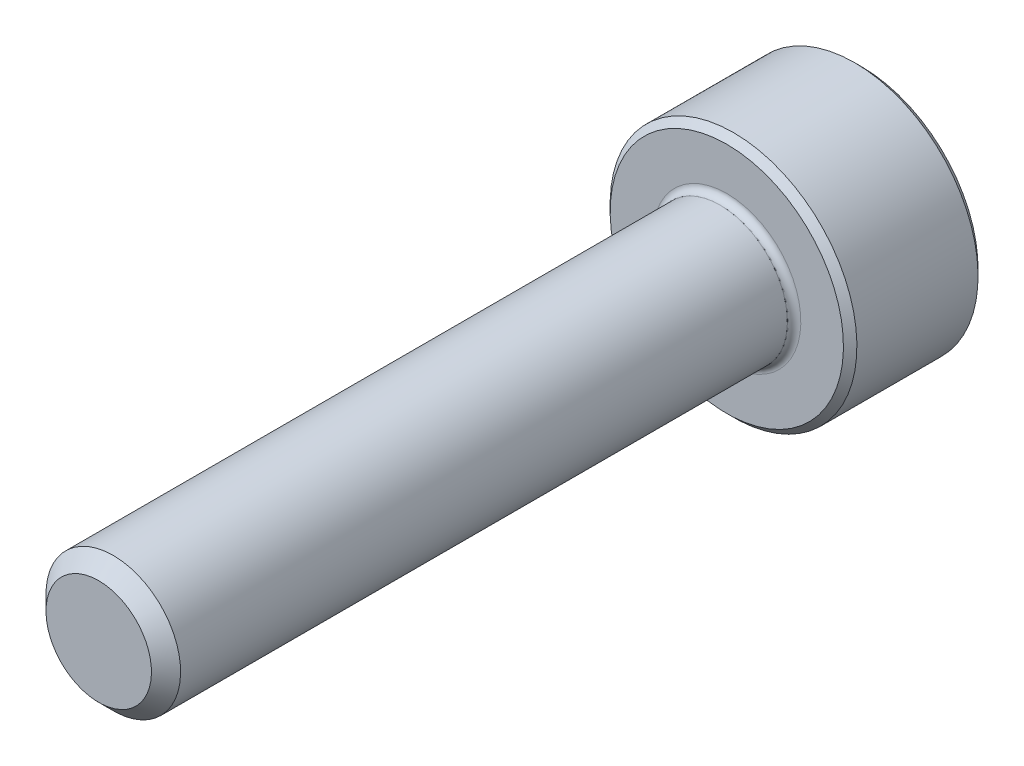
ISO-10303-21;
HEADER;
FILE_DESCRIPTION(('STEP AP214'),'2;1');
FILE_NAME('part.step','',(''),(''),'','','');
FILE_SCHEMA(('AUTOMOTIVE_DESIGN { 1 0 10303 214 1 1 1 1 }'));
ENDSEC;
DATA;
#1=APPLICATION_CONTEXT('core data for automotive mechanical design processes');
#2=APPLICATION_PROTOCOL_DEFINITION('international standard','automotive_design',2000,#1);
#3=PRODUCT_CONTEXT('',#1,'mechanical');
#4=PRODUCT('Part','Part','',(#3));
#5=PRODUCT_RELATED_PRODUCT_CATEGORY('part','',(#4));
#6=PRODUCT_DEFINITION_FORMATION('','',#4);
#7=PRODUCT_DEFINITION_CONTEXT('part definition',#1,'design');
#8=PRODUCT_DEFINITION('design','',#6,#7);
#9=PRODUCT_DEFINITION_SHAPE('','',#8);
#10=(LENGTH_UNIT() NAMED_UNIT(*) SI_UNIT(.MILLI.,.METRE.));
#11=(NAMED_UNIT(*) PLANE_ANGLE_UNIT() SI_UNIT($,.RADIAN.));
#12=(NAMED_UNIT(*) SI_UNIT($,.STERADIAN.) SOLID_ANGLE_UNIT());
#13=UNCERTAINTY_MEASURE_WITH_UNIT(LENGTH_MEASURE(1.E-05),#10,'distance_accuracy_value','');
#14=(GEOMETRIC_REPRESENTATION_CONTEXT(3) GLOBAL_UNCERTAINTY_ASSIGNED_CONTEXT((#13)) GLOBAL_UNIT_ASSIGNED_CONTEXT((#10,
#11,#12)) REPRESENTATION_CONTEXT('',''));
#15=CARTESIAN_POINT('',(0.,0.,0.));
#16=DIRECTION('',(0.,0.,1.));
#17=DIRECTION('',(1.,0.,0.));
#18=AXIS2_PLACEMENT_3D('',#15,#16,#17);
#19=CARTESIAN_POINT('',(0.,0.,-5.5));
#20=DIRECTION('',(0.,0.,-1.));
#21=DIRECTION('',(0.,-1.,0.));
#22=AXIS2_PLACEMENT_3D('',#19,#20,#21);
#23=PLANE('',#22);
#24=CARTESIAN_POINT('',(0.,0.,-5.5));
#25=DIRECTION('',(0.,0.,-1.));
#26=DIRECTION('',(0.,1.,0.));
#27=AXIS2_PLACEMENT_3D('',#24,#25,#26);
#28=CIRCLE('',#27,1.5);
#29=CARTESIAN_POINT('',(0.,1.5,-5.5));
#30=VERTEX_POINT('',#29);
#31=EDGE_CURVE('E12',#30,#30,#28,.T.);
#32=ORIENTED_EDGE('',*,*,#31,.T.);
#33=EDGE_LOOP('',(#32));
#34=FACE_BOUND('',#33,.T.);
#35=ADVANCED_FACE('F47',(#34),#23,.T.);
#36=CARTESIAN_POINT('',(0.,0.,-4.48397459621555));
#37=DIRECTION('',(0.,0.,1.));
#38=DIRECTION('',(0.,1.,0.));
#39=AXIS2_PLACEMENT_3D('',#36,#37,#38);
#40=CYLINDRICAL_SURFACE('',#39,1.5);
#41=ORIENTED_EDGE('',*,*,#31,.F.);
#42=EDGE_LOOP('',(#41));
#43=FACE_BOUND('',#42,.T.);
#44=CARTESIAN_POINT('',(0.,0.,-5.35));
#45=DIRECTION('',(0.,0.,-1.));
#46=DIRECTION('',(0.,1.,0.));
#47=AXIS2_PLACEMENT_3D('',#44,#45,#46);
#48=CIRCLE('',#47,1.5);
#49=CARTESIAN_POINT('',(0.,1.5,-5.35));
#50=VERTEX_POINT('',#49);
#51=EDGE_CURVE('E53',#50,#50,#48,.T.);
#52=ORIENTED_EDGE('',*,*,#51,.T.);
#53=EDGE_LOOP('',(#52));
#54=FACE_BOUND('',#53,.T.);
#55=ADVANCED_FACE('F58',(#43,#54),#40,.T.);
#56=CARTESIAN_POINT('',(0.,0.,-4.48397459621555));
#57=DIRECTION('',(0.,0.,-1.));
#58=DIRECTION('',(0.,-1.,0.));
#59=AXIS2_PLACEMENT_3D('',#56,#57,#58);
#60=CONICAL_SURFACE('',#59,0.,1.04719755119659);
#61=ORIENTED_EDGE('',*,*,#51,.F.);
#62=EDGE_LOOP('',(#61));
#63=FACE_BOUND('',#62,.T.);
#64=CARTESIAN_POINT('',(0.,0.,-4.48397459621555));
#65=VERTEX_POINT('',#64);
#66=VERTEX_LOOP('',#65);
#67=FACE_BOUND('',#66,.T.);
#68=ADVANCED_FACE('F56',(#63,#67),#60,.T.);
#69=CLOSED_SHELL('',(#35,#55,#68));
#70=MANIFOLD_SOLID_BREP('B2',#69);
#71=CARTESIAN_POINT('',(-2.76,-2.75,-5.35));
#72=DIRECTION('',(0.,0.,1.));
#73=DIRECTION('',(-1.,0.,0.));
#74=AXIS2_PLACEMENT_3D('',#71,#72,#73);
#75=PLANE('',#74);
#76=CARTESIAN_POINT('',(0.,0.,-5.35));
#77=DIRECTION('',(0.,0.,-1.));
#78=DIRECTION('',(0.,1.,0.));
#79=AXIS2_PLACEMENT_3D('',#76,#77,#78);
#80=CIRCLE('',#79,1.5);
#81=CARTESIAN_POINT('',(0.,1.5,-5.35));
#82=VERTEX_POINT('',#81);
#83=EDGE_CURVE('E106',#82,#82,#80,.T.);
#84=ORIENTED_EDGE('',*,*,#83,.F.);
#85=EDGE_LOOP('',(#84));
#86=FACE_BOUND('',#85,.T.);
#87=ADVANCED_FACE('F103',(#86),#75,.T.);
#88=CARTESIAN_POINT('',(0.,0.,-5.35));
#89=DIRECTION('',(0.,0.,1.));
#90=DIRECTION('',(0.,1.,0.));
#91=AXIS2_PLACEMENT_3D('',#88,#89,#90);
#92=TOROIDAL_SURFACE('',#91,1.65,0.15);
#93=CARTESIAN_POINT('',(0.,0.,-5.5));
#94=DIRECTION('',(0.,0.,-1.));
#95=DIRECTION('',(0.,1.,0.));
#96=AXIS2_PLACEMENT_3D('',#93,#94,#95);
#97=CIRCLE('',#96,1.65);
#98=CARTESIAN_POINT('',(0.,1.65,-5.5));
#99=VERTEX_POINT('',#98);
#100=EDGE_CURVE('E181',#99,#99,#97,.T.);
#101=ORIENTED_EDGE('',*,*,#100,.F.);
#102=EDGE_LOOP('',(#101));
#103=FACE_BOUND('',#102,.T.);
#104=ORIENTED_EDGE('',*,*,#83,.T.);
#105=EDGE_LOOP('',(#104));
#106=FACE_BOUND('',#105,.T.);
#107=ADVANCED_FACE('F281',(#103,#106),#92,.F.);
#108=CARTESIAN_POINT('',(0.,2.6,-5.5));
#109=DIRECTION('',(0.,0.,1.));
#110=DIRECTION('',(0.,1.,0.));
#111=AXIS2_PLACEMENT_3D('',#108,#109,#110);
#112=PLANE('',#111);
#113=CARTESIAN_POINT('',(0.,0.,-5.5));
#114=DIRECTION('',(0.,0.,-1.));
#115=DIRECTION('',(0.,1.,0.));
#116=AXIS2_PLACEMENT_3D('',#113,#114,#115);
#117=CIRCLE('',#116,2.6);
#118=CARTESIAN_POINT('',(0.,2.6,-5.5));
#119=VERTEX_POINT('',#118);
#120=EDGE_CURVE('E184',#119,#119,#117,.T.);
#121=ORIENTED_EDGE('',*,*,#120,.F.);
#122=EDGE_LOOP('',(#121));
#123=FACE_BOUND('',#122,.T.);
#124=ORIENTED_EDGE('',*,*,#100,.T.);
#125=EDGE_LOOP('',(#124));
#126=FACE_BOUND('',#125,.T.);
#127=ADVANCED_FACE('F278',(#123,#126),#112,.T.);
#128=CARTESIAN_POINT('',(0.,0.,-5.5));
#129=DIRECTION('',(0.,0.,-1.));
#130=DIRECTION('',(0.,-1.,0.));
#131=AXIS2_PLACEMENT_3D('',#128,#129,#130);
#132=CONICAL_SURFACE('',#131,2.6,0.785398163397451);
#133=CARTESIAN_POINT('',(0.,0.,-5.65));
#134=DIRECTION('',(0.,0.,-1.));
#135=DIRECTION('',(0.,1.,0.));
#136=AXIS2_PLACEMENT_3D('',#133,#134,#135);
#137=CIRCLE('',#136,2.75);
#138=CARTESIAN_POINT('',(0.,2.75,-5.65));
#139=VERTEX_POINT('',#138);
#140=EDGE_CURVE('E271',#139,#139,#137,.T.);
#141=ORIENTED_EDGE('',*,*,#140,.F.);
#142=EDGE_LOOP('',(#141));
#143=FACE_BOUND('',#142,.T.);
#144=ORIENTED_EDGE('',*,*,#120,.T.);
#145=EDGE_LOOP('',(#144));
#146=FACE_BOUND('',#145,.T.);
#147=ADVANCED_FACE('F276',(#143,#146),#132,.T.);
#148=CARTESIAN_POINT('',(0.,0.,8.5));
#149=DIRECTION('',(0.,0.,1.));
#150=DIRECTION('',(0.,1.,0.));
#151=AXIS2_PLACEMENT_3D('',#148,#149,#150);
#152=CYLINDRICAL_SURFACE('',#151,2.75);
#153=CARTESIAN_POINT('',(0.,0.,-8.35));
#154=DIRECTION('',(0.,0.,-1.));
#155=DIRECTION('',(0.,1.,0.));
#156=AXIS2_PLACEMENT_3D('',#153,#154,#155);
#157=CIRCLE('',#156,2.75);
#158=CARTESIAN_POINT('',(0.,2.75,-8.35));
#159=VERTEX_POINT('',#158);
#160=EDGE_CURVE('E268',#159,#159,#157,.T.);
#161=ORIENTED_EDGE('',*,*,#160,.F.);
#162=EDGE_LOOP('',(#161));
#163=FACE_BOUND('',#162,.T.);
#164=ORIENTED_EDGE('',*,*,#140,.T.);
#165=EDGE_LOOP('',(#164));
#166=FACE_BOUND('',#165,.T.);
#167=ADVANCED_FACE('F307',(#163,#166),#152,.T.);
#168=CARTESIAN_POINT('',(0.,0.,-8.35));
#169=DIRECTION('',(0.,0.,1.));
#170=DIRECTION('',(0.,1.,0.));
#171=AXIS2_PLACEMENT_3D('',#168,#169,#170);
#172=CONICAL_SURFACE('',#171,2.75,0.785398163397445);
#173=CARTESIAN_POINT('',(0.,0.,-8.5));
#174=DIRECTION('',(0.,0.,-1.));
#175=DIRECTION('',(0.,1.,0.));
#176=AXIS2_PLACEMENT_3D('',#173,#174,#175);
#177=CIRCLE('',#176,2.6);
#178=CARTESIAN_POINT('',(0.,2.6,-8.5));
#179=VERTEX_POINT('',#178);
#180=EDGE_CURVE('E167',#179,#179,#177,.T.);
#181=ORIENTED_EDGE('',*,*,#180,.F.);
#182=EDGE_LOOP('',(#181));
#183=FACE_BOUND('',#182,.T.);
#184=ORIENTED_EDGE('',*,*,#160,.T.);
#185=EDGE_LOOP('',(#184));
#186=FACE_BOUND('',#185,.T.);
#187=ADVANCED_FACE('F315',(#183,#186),#172,.T.);
#188=CARTESIAN_POINT('',(0.,0.,-8.5));
#189=DIRECTION('',(0.,0.,-1.));
#190=DIRECTION('',(0.,-1.,0.));
#191=AXIS2_PLACEMENT_3D('',#188,#189,#190);
#192=PLANE('',#191);
#193=CARTESIAN_POINT('',(0.,0.,-8.5));
#194=DIRECTION('',(0.,0.,1.));
#195=DIRECTION('',(1.,0.,0.));
#196=AXIS2_PLACEMENT_3D('',#193,#194,#195);
#197=CIRCLE('',#196,1.55162884844712);
#198=CARTESIAN_POINT('',(1.55162884844712,0.,-8.5));
#199=VERTEX_POINT('',#198);
#200=EDGE_CURVE('E45',#199,#199,#197,.T.);
#201=ORIENTED_EDGE('',*,*,#200,.T.);
#202=EDGE_LOOP('',(#201));
#203=FACE_BOUND('',#202,.T.);
#204=ORIENTED_EDGE('',*,*,#180,.T.);
#205=EDGE_LOOP('',(#204));
#206=FACE_BOUND('',#205,.T.);
#207=ADVANCED_FACE('F323',(#203,#206),#192,.T.);
#208=CARTESIAN_POINT('',(0.,0.,-8.5));
#209=DIRECTION('',(0.,0.,-1.));
#210=DIRECTION('',(1.,0.,0.));
#211=AXIS2_PLACEMENT_3D('',#208,#209,#210);
#212=CONICAL_SURFACE('',#211,1.55162884844712,0.78539816339745);
#213=ORIENTED_EDGE('',*,*,#200,.F.);
#214=EDGE_LOOP('',(#213));
#215=FACE_BOUND('',#214,.T.);
#216=CARTESIAN_POINT('',(-0.000199999999999042,-1.4434911430279,-8.39186230843608));
#217=CARTESIAN_POINT('',(0.0427751670715875,-1.41867941875065,-8.36706849258205));
#218=CARTESIAN_POINT('',(0.0864690047459489,-1.39345276980743,-8.34373055894563));
#219=CARTESIAN_POINT('',(0.175565930841943,-1.34201263554194,-8.30099882861148));
#220=CARTESIAN_POINT('',(0.220977498357065,-1.31579425481276,-8.28162881688736));
#221=CARTESIAN_POINT('',(0.312547820935262,-1.26292610442246,-8.24844730794042));
#222=CARTESIAN_POINT('',(0.358683240175887,-1.23628980770471,-8.2345523835796));
#223=CARTESIAN_POINT('',(0.451970080407594,-1.18243062538508,-8.21314410668758));
#224=CARTESIAN_POINT('',(0.499118649136382,-1.15520938653761,-8.20561476609373));
#225=CARTESIAN_POINT('',(0.580373556887254,-1.10829684367467,-8.19882132257765));
#226=CARTESIAN_POINT('',(0.614374876627943,-1.08866617256958,-8.1978153836313));
#227=CARTESIAN_POINT('',(0.68231776443248,-1.04943932800611,-8.19950823943827));
#228=CARTESIAN_POINT('',(0.71625931765566,-1.02984316311599,-8.20220785174249));
#229=CARTESIAN_POINT('',(0.783814856457502,-0.990839954603498,-8.21115575484333));
#230=CARTESIAN_POINT('',(0.817428507286777,-0.97143310424877,-8.21740735042665));
#231=CARTESIAN_POINT('',(0.884094638217815,-0.932943395609904,-8.23312250594085));
#232=CARTESIAN_POINT('',(0.917146871030298,-0.913860680098299,-8.24258744461441));
#233=CARTESIAN_POINT('',(1.00179969160027,-0.864986351354567,-8.27067821521453));
#234=CARTESIAN_POINT('',(1.05286649242964,-0.835502920149075,-8.29141698197915));
#235=CARTESIAN_POINT('',(1.15300085411326,-0.777690319475908,-8.33813395919842));
#236=CARTESIAN_POINT('',(1.20207431157827,-0.749357745598417,-8.36409512047371));
#237=CARTESIAN_POINT('',(1.2502,-0.721572366433194,-8.39186230843608));
#238=B_SPLINE_CURVE_WITH_KNOTS('',3,(#216,#217,#218,#219,#220,#221,#222,#223,#224,#225,#226,
#227,#228,#229,#230,#231,#232,#233,#234,#235,#236,#237),.UNSPECIFIED.,.F.,.F.,(4,2,2,2,2,2,2,2,
2,2,4),(0.,0.166533409618304,0.334037607289762,0.498880396489699,0.663307919240276,
0.780963963458828,0.898645970148455,1.01643764860773,1.1342799317155,1.32148652032141,
1.50809158792573),.UNSPECIFIED.);
#239=CARTESIAN_POINT('',(0.,-1.44337567297406,-8.39174682452695));
#240=VERTEX_POINT('',#239);
#241=CARTESIAN_POINT('',(1.25,-0.721687836487032,-8.39174682452695));
#242=VERTEX_POINT('',#241);
#243=EDGE_CURVE('E161',#240,#242,#238,.T.);
#244=ORIENTED_EDGE('',*,*,#243,.T.);
#245=CARTESIAN_POINT('',(1.25,-1.52022146239345,-8.91651070319084));
#246=CARTESIAN_POINT('',(1.25,-1.48354689134962,-8.88818689718723));
#247=CARTESIAN_POINT('',(1.25,-1.44667707589305,-8.86011672093047));
#248=CARTESIAN_POINT('',(1.25,-1.37246477804769,-8.80459065501776));
#249=CARTESIAN_POINT('',(1.25,-1.33512218721453,-8.77713491044788));
#250=CARTESIAN_POINT('',(1.25,-1.22171630832114,-8.6954580977105));
#251=CARTESIAN_POINT('',(1.25,-1.14482995781092,-8.6423614251193));
#252=CARTESIAN_POINT('',(1.25,-0.983056768942586,-8.53734973416941));
#253=CARTESIAN_POINT('',(1.25,-0.897974111811056,-8.48573326925832));
#254=CARTESIAN_POINT('',(1.25,-0.723462355215556,-8.39078355108508));
#255=CARTESIAN_POINT('',(1.25,-0.634049271919706,-8.34742232185916));
#256=CARTESIAN_POINT('',(1.25,-0.5005887711437,-8.29435177040724));
#257=CARTESIAN_POINT('',(1.25,-0.45869172620811,-8.27926501327173));
#258=CARTESIAN_POINT('',(1.25,-0.373815329706779,-8.25244749770266));
#259=CARTESIAN_POINT('',(1.25,-0.330835910419723,-8.24071694982871));
#260=CARTESIAN_POINT('',(1.25,-0.244810833071149,-8.22144313304601));
#261=CARTESIAN_POINT('',(1.25,-0.20178270746757,-8.21382289169454));
#262=CARTESIAN_POINT('',(1.25,-0.115176247984995,-8.20293190707963));
#263=CARTESIAN_POINT('',(1.25,-0.0715980347745604,-8.1996602260857));
#264=CARTESIAN_POINT('',(1.25,0.0136806197531958,-8.19775210045869));
#265=CARTESIAN_POINT('',(1.25,0.055376537004704,-8.19891205716704));
#266=CARTESIAN_POINT('',(1.25,0.138449096453159,-8.20533266388464));
#267=CARTESIAN_POINT('',(1.25,0.179825709781941,-8.21059368038276));
#268=CARTESIAN_POINT('',(1.25,0.262662840763598,-8.22500574721218));
#269=CARTESIAN_POINT('',(1.25,0.304111120669651,-8.23422600730023));
#270=CARTESIAN_POINT('',(1.25,0.386089884230834,-8.25604235623938));
#271=CARTESIAN_POINT('',(1.25,0.426620414510368,-8.26863827317792));
#272=CARTESIAN_POINT('',(1.25,0.550794781768361,-8.31205959164791));
#273=CARTESIAN_POINT('',(1.25,0.632755591043411,-8.34768282700966));
#274=CARTESIAN_POINT('',(1.25,0.792852508946381,-8.42696814455953));
#275=CARTESIAN_POINT('',(1.25,0.870973935410875,-8.47065844211049));
#276=CARTESIAN_POINT('',(1.25,1.02031328199646,-8.56088158787621));
#277=CARTESIAN_POINT('',(1.25,1.09168171050215,-8.60716845879521));
#278=CARTESIAN_POINT('',(1.25,1.19682802849918,-8.67876149953674));
#279=CARTESIAN_POINT('',(1.25,1.2314248214359,-8.70288582787532));
#280=CARTESIAN_POINT('',(1.25,1.30014350643268,-8.75178258410313));
#281=CARTESIAN_POINT('',(1.25,1.33426552680451,-8.7765548314612));
#282=CARTESIAN_POINT('',(1.25,1.36818950249276,-8.8015960474388));
#283=B_SPLINE_CURVE_WITH_KNOTS('',3,(#245,#246,#247,#248,#249,#250,#251,#252,#253,#254,#255,
#256,#257,#258,#259,#260,#261,#262,#263,#264,#265,#266,#267,#268,#269,#270,#271,#272,#273,#274,
#275,#276,#277,#278,#279,#280,#281,#282),.UNSPECIFIED.,.F.,.F.,(4,2,2,2,2,2,2,2,2,2,2,2,2,2,2,2,
2,2,4),(0.,0.139012369615044,0.278057225136917,0.55825950405377,0.856585057342473,
1.15388088887298,1.28736138903992,1.42085026158167,1.55174393609413,1.68260937990424,
1.80753647715252,1.93247473971975,2.05969207441603,2.18690293152764,2.45422704655832,
2.72250450232038,2.97756898823762,3.10409578574714,3.23058769667827),.UNSPECIFIED.);
#284=CARTESIAN_POINT('',(1.25,0.721687836487032,-8.39174682452695));
#285=VERTEX_POINT('',#284);
#286=EDGE_CURVE('E170',#242,#285,#283,.T.);
#287=ORIENTED_EDGE('',*,*,#286,.T.);
#288=CARTESIAN_POINT('',(1.2502,0.721572366433194,-8.39186230843608));
#289=CARTESIAN_POINT('',(1.20722483292841,0.746384090710444,-8.36706849258205));
#290=CARTESIAN_POINT('',(1.16353099525405,0.771610739653664,-8.34373055894563));
#291=CARTESIAN_POINT('',(1.07443406915806,0.823050873919154,-8.30099882861148));
#292=CARTESIAN_POINT('',(1.02902250164294,0.849269254648332,-8.28162881688736));
#293=CARTESIAN_POINT('',(0.937452179064742,0.902137405038634,-8.24844730794042));
#294=CARTESIAN_POINT('',(0.891316759824116,0.928773701756386,-8.2345523835796));
#295=CARTESIAN_POINT('',(0.79802991959241,0.982632884076011,-8.21314410668758));
#296=CARTESIAN_POINT('',(0.750881350863623,1.00985412292348,-8.20561476609373));
#297=CARTESIAN_POINT('',(0.66962644311275,1.05676666578643,-8.19882132257765));
#298=CARTESIAN_POINT('',(0.635625123372062,1.07639733689152,-8.1978153836313));
#299=CARTESIAN_POINT('',(0.567682235567525,1.11562418145499,-8.19950823943827));
#300=CARTESIAN_POINT('',(0.533740682344345,1.1352203463451,-8.20220785174248));
#301=CARTESIAN_POINT('',(0.466185143542503,1.1742235548576,-8.21115575484332));
#302=CARTESIAN_POINT('',(0.432571492713228,1.19363040521232,-8.21740735042665));
#303=CARTESIAN_POINT('',(0.36590536178219,1.23212011385119,-8.23312250594085));
#304=CARTESIAN_POINT('',(0.332853128969707,1.25120282936279,-8.2425874446144));
#305=CARTESIAN_POINT('',(0.248200308399738,1.30007715810653,-8.27067821521453));
#306=CARTESIAN_POINT('',(0.197133507570364,1.32956058931202,-8.29141698197915));
#307=CARTESIAN_POINT('',(0.096999145886746,1.38737318998519,-8.33813395919842));
#308=CARTESIAN_POINT('',(0.0479256884217307,1.41570576386268,-8.36409512047371));
#309=CARTESIAN_POINT('',(-0.000200000000000498,1.4434911430279,-8.39186230843608));
#310=B_SPLINE_CURVE_WITH_KNOTS('',3,(#288,#289,#290,#291,#292,#293,#294,#295,#296,#297,#298,
#299,#300,#301,#302,#303,#304,#305,#306,#307,#308,#309),.UNSPECIFIED.,.F.,.F.,(4,2,2,2,2,2,2,2,
2,2,4),(0.,0.166533409618303,0.33403760728976,0.498880396489696,0.663307919240271,
0.780963963458823,0.898645970148449,1.01643764860773,1.13427993171549,1.32148652032141,
1.50809158792574),.UNSPECIFIED.);
#311=CARTESIAN_POINT('',(0.,1.44337567297406,-8.39174682452695));
#312=VERTEX_POINT('',#311);
#313=EDGE_CURVE('E176',#285,#312,#310,.T.);
#314=ORIENTED_EDGE('',*,*,#313,.T.);
#315=CARTESIAN_POINT('',(0.000199999999999644,1.4434911430279,-8.39186230843608));
#316=CARTESIAN_POINT('',(-0.0427751670715867,1.41867941875065,-8.36706849258205));
#317=CARTESIAN_POINT('',(-0.0864690047459477,1.39345276980743,-8.34373055894563));
#318=CARTESIAN_POINT('',(-0.175565930841941,1.34201263554194,-8.30099882861148));
#319=CARTESIAN_POINT('',(-0.220977498357063,1.31579425481276,-8.28162881688736));
#320=CARTESIAN_POINT('',(-0.312547820935258,1.26292610442246,-8.24844730794042));
#321=CARTESIAN_POINT('',(-0.358683240175884,1.23628980770471,-8.2345523835796));
#322=CARTESIAN_POINT('',(-0.451970080407591,1.18243062538509,-8.21314410668758));
#323=CARTESIAN_POINT('',(-0.499118649136378,1.15520938653761,-8.20561476609373));
#324=CARTESIAN_POINT('',(-0.58037355688725,1.10829684367467,-8.19882132257765));
#325=CARTESIAN_POINT('',(-0.614374876627939,1.08866617256958,-8.1978153836313));
#326=CARTESIAN_POINT('',(-0.682317764432475,1.04943932800611,-8.19950823943827));
#327=CARTESIAN_POINT('',(-0.716259317655655,1.02984316311599,-8.20220785174248));
#328=CARTESIAN_POINT('',(-0.783814856457497,0.9908399546035,-8.21115575484332));
#329=CARTESIAN_POINT('',(-0.817428507286773,0.971433104248772,-8.21740735042665));
#330=CARTESIAN_POINT('',(-0.884094638217811,0.932943395609906,-8.23312250594085));
#331=CARTESIAN_POINT('',(-0.917146871030293,0.913860680098302,-8.2425874446144));
#332=CARTESIAN_POINT('',(-1.00179969160026,0.864986351354569,-8.27067821521453));
#333=CARTESIAN_POINT('',(-1.05286649242964,0.835502920149077,-8.29141698197915));
#334=CARTESIAN_POINT('',(-1.15300085411325,0.777690319475909,-8.33813395919842));
#335=CARTESIAN_POINT('',(-1.20207431157827,0.749357745598417,-8.36409512047371));
#336=CARTESIAN_POINT('',(-1.2502,0.721572366433194,-8.39186230843608));
#337=B_SPLINE_CURVE_WITH_KNOTS('',3,(#315,#316,#317,#318,#319,#320,#321,#322,#323,#324,#325,
#326,#327,#328,#329,#330,#331,#332,#333,#334,#335,#336),.UNSPECIFIED.,.F.,.F.,(4,2,2,2,2,2,2,2,
2,2,4),(0.,0.166533409618303,0.33403760728976,0.498880396489696,0.663307919240272,
0.780963963458824,0.89864597014845,1.01643764860773,1.13427993171549,1.3214865203214,
1.50809158792573),.UNSPECIFIED.);
#338=CARTESIAN_POINT('',(-1.25,0.721687836487032,-8.39174682452695));
#339=VERTEX_POINT('',#338);
#340=EDGE_CURVE('E217',#312,#339,#337,.T.);
#341=ORIENTED_EDGE('',*,*,#340,.T.);
#342=CARTESIAN_POINT('',(-1.25,-1.52022146239345,-8.91651070319084));
#343=CARTESIAN_POINT('',(-1.25,-1.48354689134962,-8.88818689718723));
#344=CARTESIAN_POINT('',(-1.25,-1.44667707589305,-8.86011672093047));
#345=CARTESIAN_POINT('',(-1.25,-1.37246477804769,-8.80459065501776));
#346=CARTESIAN_POINT('',(-1.25,-1.33512218721453,-8.77713491044788));
#347=CARTESIAN_POINT('',(-1.25,-1.22171630832114,-8.6954580977105));
#348=CARTESIAN_POINT('',(-1.25,-1.14482995781092,-8.6423614251193));
#349=CARTESIAN_POINT('',(-1.25,-0.983056768942586,-8.53734973416941));
#350=CARTESIAN_POINT('',(-1.25,-0.897974111811055,-8.48573326925832));
#351=CARTESIAN_POINT('',(-1.25,-0.723462355215555,-8.39078355108508));
#352=CARTESIAN_POINT('',(-1.25,-0.634049271919705,-8.34742232185916));
#353=CARTESIAN_POINT('',(-1.25,-0.500588771143699,-8.29435177040724));
#354=CARTESIAN_POINT('',(-1.25,-0.45869172620811,-8.27926501327173));
#355=CARTESIAN_POINT('',(-1.25,-0.373815329706778,-8.25244749770266));
#356=CARTESIAN_POINT('',(-1.25,-0.330835910419723,-8.24071694982871));
#357=CARTESIAN_POINT('',(-1.25,-0.244810833071148,-8.22144313304601));
#358=CARTESIAN_POINT('',(-1.25,-0.20178270746757,-8.21382289169454));
#359=CARTESIAN_POINT('',(-1.25,-0.115176247984995,-8.20293190707963));
#360=CARTESIAN_POINT('',(-1.25,-0.0715980347745597,-8.1996602260857));
#361=CARTESIAN_POINT('',(-1.25,0.0136806197531965,-8.19775210045869));
#362=CARTESIAN_POINT('',(-1.25,0.0553765370047047,-8.19891205716704));
#363=CARTESIAN_POINT('',(-1.25,0.13844909645316,-8.20533266388464));
#364=CARTESIAN_POINT('',(-1.25,0.179825709781942,-8.21059368038276));
#365=CARTESIAN_POINT('',(-1.25,0.262662840763598,-8.22500574721218));
#366=CARTESIAN_POINT('',(-1.25,0.304111120669651,-8.23422600730023));
#367=CARTESIAN_POINT('',(-1.25,0.386089884230834,-8.25604235623938));
#368=CARTESIAN_POINT('',(-1.25,0.426620414510369,-8.26863827317792));
#369=CARTESIAN_POINT('',(-1.25,0.550794781768361,-8.31205959164791));
#370=CARTESIAN_POINT('',(-1.25,0.632755591043411,-8.34768282700966));
#371=CARTESIAN_POINT('',(-1.25,0.792852508946382,-8.42696814455953));
#372=CARTESIAN_POINT('',(-1.25,0.870973935410875,-8.47065844211049));
#373=CARTESIAN_POINT('',(-1.25,1.02031328199646,-8.56088158787621));
#374=CARTESIAN_POINT('',(-1.25,1.09168171050215,-8.60716845879521));
#375=CARTESIAN_POINT('',(-1.25,1.19682802849917,-8.67876149953673));
#376=CARTESIAN_POINT('',(-1.25,1.23142482143589,-8.70288582787532));
#377=CARTESIAN_POINT('',(-1.25,1.30014350643268,-8.75178258410313));
#378=CARTESIAN_POINT('',(-1.25,1.33426552680451,-8.7765548314612));
#379=CARTESIAN_POINT('',(-1.25,1.36818950249276,-8.8015960474388));
#380=B_SPLINE_CURVE_WITH_KNOTS('',3,(#342,#343,#344,#345,#346,#347,#348,#349,#350,#351,#352,
#353,#354,#355,#356,#357,#358,#359,#360,#361,#362,#363,#364,#365,#366,#367,#368,#369,#370,#371,
#372,#373,#374,#375,#376,#377,#378,#379),.UNSPECIFIED.,.F.,.F.,(4,2,2,2,2,2,2,2,2,2,2,2,2,2,2,2,
2,2,4),(0.,0.139012369615044,0.278057225136918,0.558259504053771,0.856585057342474,
1.15388088887299,1.28736138903992,1.42085026158167,1.55174393609413,1.68260937990424,
1.80753647715252,1.93247473971975,2.05969207441603,2.18690293152764,2.45422704655832,
2.72250450232039,2.97756898823762,3.10409578574714,3.23058769667827),.UNSPECIFIED.);
#381=CARTESIAN_POINT('',(-1.25,-0.721687836487032,-8.39174682452695));
#382=VERTEX_POINT('',#381);
#383=EDGE_CURVE('E211',#339,#382,#380,.F.);
#384=ORIENTED_EDGE('',*,*,#383,.T.);
#385=CARTESIAN_POINT('',(-1.2502,-0.721572366433195,-8.39186230843608));
#386=CARTESIAN_POINT('',(-1.20722483292841,-0.746384090710444,-8.36706849258205));
#387=CARTESIAN_POINT('',(-1.16353099525405,-0.771610739653665,-8.34373055894563));
#388=CARTESIAN_POINT('',(-1.07443406915806,-0.823050873919155,-8.30099882861148));
#389=CARTESIAN_POINT('',(-1.02902250164294,-0.849269254648334,-8.28162881688736));
#390=CARTESIAN_POINT('',(-0.937452179064739,-0.902137405038636,-8.24844730794042));
#391=CARTESIAN_POINT('',(-0.891316759824113,-0.928773701756388,-8.2345523835796));
#392=CARTESIAN_POINT('',(-0.798029919592406,-0.982632884076013,-8.21314410668758));
#393=CARTESIAN_POINT('',(-0.750881350863618,-1.00985412292348,-8.20561476609373));
#394=CARTESIAN_POINT('',(-0.669626443112746,-1.05676666578643,-8.19882132257765));
#395=CARTESIAN_POINT('',(-0.635625123372057,-1.07639733689152,-8.1978153836313));
#396=CARTESIAN_POINT('',(-0.567682235567521,-1.11562418145499,-8.19950823943827));
#397=CARTESIAN_POINT('',(-0.53374068234434,-1.1352203463451,-8.20220785174248));
#398=CARTESIAN_POINT('',(-0.466185143542498,-1.1742235548576,-8.21115575484332));
#399=CARTESIAN_POINT('',(-0.432571492713223,-1.19363040521233,-8.21740735042665));
#400=CARTESIAN_POINT('',(-0.365905361782185,-1.23212011385119,-8.23312250594085));
#401=CARTESIAN_POINT('',(-0.332853128969702,-1.2512028293628,-8.24258744461441));
#402=CARTESIAN_POINT('',(-0.248200308399734,-1.30007715810653,-8.27067821521453));
#403=CARTESIAN_POINT('',(-0.19713350757036,-1.32956058931202,-8.29141698197915));
#404=CARTESIAN_POINT('',(-0.0969991458867441,-1.38737318998519,-8.33813395919842));
#405=CARTESIAN_POINT('',(-0.0479256884217298,-1.41570576386268,-8.36409512047371));
#406=CARTESIAN_POINT('',(0.000200000000000625,-1.4434911430279,-8.39186230843608));
#407=B_SPLINE_CURVE_WITH_KNOTS('',3,(#385,#386,#387,#388,#389,#390,#391,#392,#393,#394,#395,
#396,#397,#398,#399,#400,#401,#402,#403,#404,#405,#406),.UNSPECIFIED.,.F.,.F.,(4,2,2,2,2,2,2,2,
2,2,4),(0.,0.166533409618304,0.334037607289762,0.498880396489699,0.663307919240276,
0.780963963458829,0.898645970148455,1.01643764860773,1.1342799317155,1.32148652032141,
1.50809158792574),.UNSPECIFIED.);
#408=EDGE_CURVE('E111',#382,#240,#407,.T.);
#409=ORIENTED_EDGE('',*,*,#408,.T.);
#410=EDGE_LOOP('',(#244,#287,#314,#341,#384,#409));
#411=FACE_BOUND('',#410,.T.);
#412=ADVANCED_FACE('F179',(#215,#411),#212,.F.);
#413=CARTESIAN_POINT('',(0.,2.6,-6.5));
#414=DIRECTION('',(0.,0.,1.));
#415=DIRECTION('',(0.,1.,0.));
#416=AXIS2_PLACEMENT_3D('',#413,#414,#415);
#417=PLANE('',#416);
#418=DIRECTION('',(0.866025403784438,0.5,0.));
#419=VECTOR('',#418,1.);
#420=CARTESIAN_POINT('',(0.,-1.44337567297406,-6.5));
#421=LINE('',#420,#419);
#422=CARTESIAN_POINT('',(0.,-1.44337567297406,-6.5));
#423=VERTEX_POINT('',#422);
#424=CARTESIAN_POINT('',(1.25,-0.721687836487032,-6.5));
#425=VERTEX_POINT('',#424);
#426=EDGE_CURVE('E163',#423,#425,#421,.T.);
#427=ORIENTED_EDGE('',*,*,#426,.F.);
#428=DIRECTION('',(0.866025403784439,-0.5,0.));
#429=VECTOR('',#428,1.);
#430=CARTESIAN_POINT('',(-1.25,-0.721687836487032,-6.5));
#431=LINE('',#430,#429);
#432=CARTESIAN_POINT('',(-1.25,-0.721687836487033,-6.5));
#433=VERTEX_POINT('',#432);
#434=EDGE_CURVE('E249',#433,#423,#431,.T.);
#435=ORIENTED_EDGE('',*,*,#434,.F.);
#436=DIRECTION('',(0.,-1.,0.));
#437=VECTOR('',#436,1.);
#438=CARTESIAN_POINT('',(-1.25,0.721687836487032,-6.5));
#439=LINE('',#438,#437);
#440=CARTESIAN_POINT('',(-1.25,0.721687836487032,-6.5));
#441=VERTEX_POINT('',#440);
#442=EDGE_CURVE('E251',#441,#433,#439,.T.);
#443=ORIENTED_EDGE('',*,*,#442,.F.);
#444=DIRECTION('',(-0.866025403784439,-0.5,0.));
#445=VECTOR('',#444,1.);
#446=CARTESIAN_POINT('',(0.,1.44337567297406,-6.5));
#447=LINE('',#446,#445);
#448=CARTESIAN_POINT('',(0.,1.44337567297406,-6.5));
#449=VERTEX_POINT('',#448);
#450=EDGE_CURVE('E254',#449,#441,#447,.T.);
#451=ORIENTED_EDGE('',*,*,#450,.F.);
#452=DIRECTION('',(-0.866025403784439,0.5,0.));
#453=VECTOR('',#452,1.);
#454=CARTESIAN_POINT('',(1.25,0.721687836487032,-6.5));
#455=LINE('',#454,#453);
#456=CARTESIAN_POINT('',(1.25,0.721687836487032,-6.5));
#457=VERTEX_POINT('',#456);
#458=EDGE_CURVE('E258',#457,#449,#455,.T.);
#459=ORIENTED_EDGE('',*,*,#458,.F.);
#460=DIRECTION('',(0.,1.,0.));
#461=VECTOR('',#460,1.);
#462=CARTESIAN_POINT('',(1.25,-0.721687836487032,-6.5));
#463=LINE('',#462,#461);
#464=EDGE_CURVE('E177',#425,#457,#463,.T.);
#465=ORIENTED_EDGE('',*,*,#464,.F.);
#466=EDGE_LOOP('',(#427,#435,#443,#451,#459,#465));
#467=FACE_BOUND('',#466,.T.);
#468=ADVANCED_FACE('F198',(#467),#417,.F.);
#469=CARTESIAN_POINT('',(0.,-1.44337567297406,-1.68118692087013));
#470=DIRECTION('',(0.5,-0.866025403784438,0.));
#471=DIRECTION('',(0.866025403784438,0.5,0.));
#472=AXIS2_PLACEMENT_3D('',#469,#470,#471);
#473=PLANE('',#472);
#474=DIRECTION('',(0.,0.,-1.));
#475=VECTOR('',#474,1.);
#476=CARTESIAN_POINT('',(0.,-1.44337567297406,-1.68118692087013));
#477=LINE('',#476,#475);
#478=EDGE_CURVE('E118',#423,#240,#477,.T.);
#479=ORIENTED_EDGE('',*,*,#478,.F.);
#480=ORIENTED_EDGE('',*,*,#426,.T.);
#481=DIRECTION('',(0.,0.,-1.));
#482=VECTOR('',#481,1.);
#483=CARTESIAN_POINT('',(1.25,-0.721687836487032,-1.68118692087013));
#484=LINE('',#483,#482);
#485=EDGE_CURVE('E157',#425,#242,#484,.T.);
#486=ORIENTED_EDGE('',*,*,#485,.T.);
#487=ORIENTED_EDGE('',*,*,#243,.F.);
#488=EDGE_LOOP('',(#479,#480,#486,#487));
#489=FACE_BOUND('',#488,.T.);
#490=ADVANCED_FACE('F159',(#489),#473,.F.);
#491=CARTESIAN_POINT('',(-1.25,-0.721687836487032,-1.68118692087013));
#492=DIRECTION('',(-0.5,-0.866025403784439,0.));
#493=DIRECTION('',(0.866025403784439,-0.5,0.));
#494=AXIS2_PLACEMENT_3D('',#491,#492,#493);
#495=PLANE('',#494);
#496=DIRECTION('',(0.,0.,-1.));
#497=VECTOR('',#496,1.);
#498=CARTESIAN_POINT('',(-1.25,-0.721687836487032,-1.68118692087013));
#499=LINE('',#498,#497);
#500=EDGE_CURVE('E126',#433,#382,#499,.T.);
#501=ORIENTED_EDGE('',*,*,#500,.F.);
#502=ORIENTED_EDGE('',*,*,#434,.T.);
#503=ORIENTED_EDGE('',*,*,#478,.T.);
#504=ORIENTED_EDGE('',*,*,#408,.F.);
#505=EDGE_LOOP('',(#501,#502,#503,#504));
#506=FACE_BOUND('',#505,.T.);
#507=ADVANCED_FACE('F197',(#506),#495,.F.);
#508=CARTESIAN_POINT('',(-1.25,0.721687836487032,-1.68118692087013));
#509=DIRECTION('',(-1.,0.,0.));
#510=DIRECTION('',(0.,0.,-1.));
#511=AXIS2_PLACEMENT_3D('',#508,#509,#510);
#512=PLANE('',#511);
#513=DIRECTION('',(0.,0.,-1.));
#514=VECTOR('',#513,1.);
#515=CARTESIAN_POINT('',(-1.25,0.721687836487032,-1.68118692087013));
#516=LINE('',#515,#514);
#517=EDGE_CURVE('E253',#441,#339,#516,.T.);
#518=ORIENTED_EDGE('',*,*,#517,.F.);
#519=ORIENTED_EDGE('',*,*,#442,.T.);
#520=ORIENTED_EDGE('',*,*,#500,.T.);
#521=ORIENTED_EDGE('',*,*,#383,.F.);
#522=EDGE_LOOP('',(#518,#519,#520,#521));
#523=FACE_BOUND('',#522,.T.);
#524=ADVANCED_FACE('F202',(#523),#512,.F.);
#525=CARTESIAN_POINT('',(0.,1.44337567297406,-1.68118692087013));
#526=DIRECTION('',(-0.5,0.866025403784438,0.));
#527=DIRECTION('',(-0.866025403784439,-0.5,0.));
#528=AXIS2_PLACEMENT_3D('',#525,#526,#527);
#529=PLANE('',#528);
#530=DIRECTION('',(0.,0.,-1.));
#531=VECTOR('',#530,1.);
#532=CARTESIAN_POINT('',(0.,1.44337567297406,-1.68118692087013));
#533=LINE('',#532,#531);
#534=EDGE_CURVE('E257',#449,#312,#533,.T.);
#535=ORIENTED_EDGE('',*,*,#534,.F.);
#536=ORIENTED_EDGE('',*,*,#450,.T.);
#537=ORIENTED_EDGE('',*,*,#517,.T.);
#538=ORIENTED_EDGE('',*,*,#340,.F.);
#539=EDGE_LOOP('',(#535,#536,#537,#538));
#540=FACE_BOUND('',#539,.T.);
#541=ADVANCED_FACE('F229',(#540),#529,.F.);
#542=CARTESIAN_POINT('',(1.25,0.721687836487032,-1.68118692087013));
#543=DIRECTION('',(0.5,0.866025403784439,0.));
#544=DIRECTION('',(-0.866025403784439,0.5,0.));
#545=AXIS2_PLACEMENT_3D('',#542,#543,#544);
#546=PLANE('',#545);
#547=DIRECTION('',(0.,0.,-1.));
#548=VECTOR('',#547,1.);
#549=CARTESIAN_POINT('',(1.25,0.721687836487032,-1.68118692087013));
#550=LINE('',#549,#548);
#551=EDGE_CURVE('E172',#457,#285,#550,.T.);
#552=ORIENTED_EDGE('',*,*,#551,.F.);
#553=ORIENTED_EDGE('',*,*,#458,.T.);
#554=ORIENTED_EDGE('',*,*,#534,.T.);
#555=ORIENTED_EDGE('',*,*,#313,.F.);
#556=EDGE_LOOP('',(#552,#553,#554,#555));
#557=FACE_BOUND('',#556,.T.);
#558=ADVANCED_FACE('F232',(#557),#546,.F.);
#559=CARTESIAN_POINT('',(1.25,-0.721687836487032,-1.68118692087013));
#560=DIRECTION('',(1.,0.,0.));
#561=DIRECTION('',(0.,0.,1.));
#562=AXIS2_PLACEMENT_3D('',#559,#560,#561);
#563=PLANE('',#562);
#564=ORIENTED_EDGE('',*,*,#485,.F.);
#565=ORIENTED_EDGE('',*,*,#464,.T.);
#566=ORIENTED_EDGE('',*,*,#551,.T.);
#567=ORIENTED_EDGE('',*,*,#286,.F.);
#568=EDGE_LOOP('',(#564,#565,#566,#567));
#569=FACE_BOUND('',#568,.T.);
#570=ADVANCED_FACE('F171',(#569),#563,.F.);
#571=CLOSED_SHELL('',(#87,#107,#127,#147,#167,#187,#207,#412,#468,#490,#507,#524,#541,#558,#570));
#572=MANIFOLD_SOLID_BREP('B6',#571);
#573=CARTESIAN_POINT('',(-2.76,-2.75,-5.35));
#574=DIRECTION('',(0.,0.,1.));
#575=DIRECTION('',(-1.,0.,0.));
#576=AXIS2_PLACEMENT_3D('',#573,#574,#575);
#577=PLANE('',#576);
#578=CARTESIAN_POINT('',(0.,0.,-5.35));
#579=DIRECTION('',(0.,0.,-1.));
#580=DIRECTION('',(0.,1.,0.));
#581=AXIS2_PLACEMENT_3D('',#578,#579,#580);
#582=CIRCLE('',#581,1.5);
#583=CARTESIAN_POINT('',(0.,1.5,-5.35));
#584=VERTEX_POINT('',#583);
#585=EDGE_CURVE('E458',#584,#584,#582,.T.);
#586=ORIENTED_EDGE('',*,*,#585,.T.);
#587=EDGE_LOOP('',(#586));
#588=FACE_BOUND('',#587,.T.);
#589=ADVANCED_FACE('F448',(#588),#577,.F.);
#590=CARTESIAN_POINT('',(0.,1.17524047358084,8.5));
#591=DIRECTION('',(0.,0.,1.));
#592=DIRECTION('',(0.,1.,0.));
#593=AXIS2_PLACEMENT_3D('',#590,#591,#592);
#594=PLANE('',#593);
#595=CARTESIAN_POINT('',(0.,0.,8.5));
#596=DIRECTION('',(0.,0.,-1.));
#597=DIRECTION('',(0.,1.,0.));
#598=AXIS2_PLACEMENT_3D('',#595,#596,#597);
#599=CIRCLE('',#598,1.17524047358084);
#600=CARTESIAN_POINT('',(0.,1.17524047358084,8.5));
#601=VERTEX_POINT('',#600);
#602=EDGE_CURVE('E102',#601,#601,#599,.T.);
#603=ORIENTED_EDGE('',*,*,#602,.F.);
#604=EDGE_LOOP('',(#603));
#605=FACE_BOUND('',#604,.T.);
#606=ADVANCED_FACE('F473',(#605),#594,.T.);
#607=CARTESIAN_POINT('',(0.,0.,8.5));
#608=DIRECTION('',(0.,0.,-1.));
#609=DIRECTION('',(0.,-1.,0.));
#610=AXIS2_PLACEMENT_3D('',#607,#608,#609);
#611=CONICAL_SURFACE('',#610,1.17524047358084,0.785398163397446);
#612=CARTESIAN_POINT('',(0.,0.,8.17524047358083));
#613=DIRECTION('',(0.,0.,-1.));
#614=DIRECTION('',(0.,1.,0.));
#615=AXIS2_PLACEMENT_3D('',#612,#613,#614);
#616=CIRCLE('',#615,1.5);
#617=CARTESIAN_POINT('',(0.,1.5,8.17524047358083));
#618=VERTEX_POINT('',#617);
#619=EDGE_CURVE('E454',#618,#618,#616,.T.);
#620=ORIENTED_EDGE('',*,*,#619,.F.);
#621=EDGE_LOOP('',(#620));
#622=FACE_BOUND('',#621,.T.);
#623=ORIENTED_EDGE('',*,*,#602,.T.);
#624=EDGE_LOOP('',(#623));
#625=FACE_BOUND('',#624,.T.);
#626=ADVANCED_FACE('F468',(#622,#625),#611,.T.);
#627=CARTESIAN_POINT('',(0.,0.,8.5));
#628=DIRECTION('',(0.,0.,1.));
#629=DIRECTION('',(0.,1.,0.));
#630=AXIS2_PLACEMENT_3D('',#627,#628,#629);
#631=CYLINDRICAL_SURFACE('',#630,1.5);
#632=ORIENTED_EDGE('',*,*,#585,.F.);
#633=EDGE_LOOP('',(#632));
#634=FACE_BOUND('',#633,.T.);
#635=ORIENTED_EDGE('',*,*,#619,.T.);
#636=EDGE_LOOP('',(#635));
#637=FACE_BOUND('',#636,.T.);
#638=ADVANCED_FACE('F466',(#634,#637),#631,.T.);
#639=CLOSED_SHELL('',(#589,#606,#626,#638));
#640=MANIFOLD_SOLID_BREP('B39',#639);
#641=ADVANCED_BREP_SHAPE_REPRESENTATION('',(#18,#70,#572,#640),#14);
#642=SHAPE_DEFINITION_REPRESENTATION(#9,#641);
ENDSEC;
END-ISO-10303-21;
